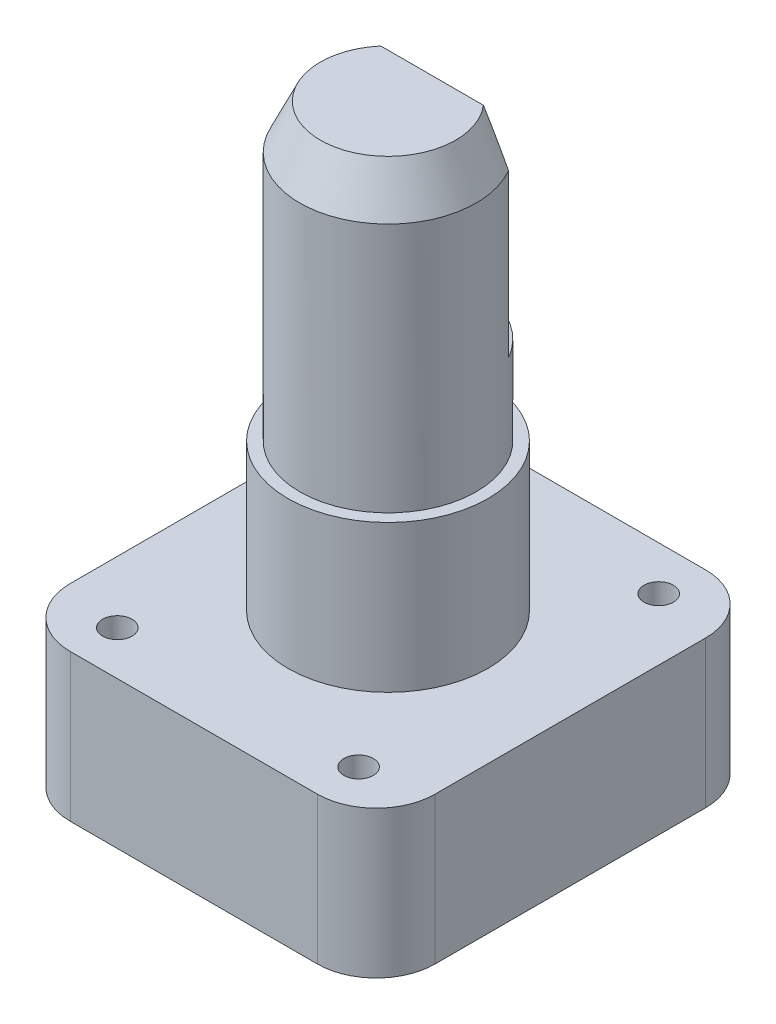
ISO-10303-21;
HEADER;
FILE_DESCRIPTION(('STEP AP214'),'2;1');
FILE_NAME('part.step','',(''),(''),'','','');
FILE_SCHEMA(('AUTOMOTIVE_DESIGN { 1 0 10303 214 1 1 1 1 }'));
ENDSEC;
DATA;
#1=APPLICATION_CONTEXT('core data for automotive mechanical design processes');
#2=APPLICATION_PROTOCOL_DEFINITION('international standard','automotive_design',2000,#1);
#3=PRODUCT_CONTEXT('',#1,'mechanical');
#4=PRODUCT('Part','Part','',(#3));
#5=PRODUCT_RELATED_PRODUCT_CATEGORY('part','',(#4));
#6=PRODUCT_DEFINITION_FORMATION('','',#4);
#7=PRODUCT_DEFINITION_CONTEXT('part definition',#1,'design');
#8=PRODUCT_DEFINITION('design','',#6,#7);
#9=PRODUCT_DEFINITION_SHAPE('','',#8);
#10=(LENGTH_UNIT() NAMED_UNIT(*) SI_UNIT(.MILLI.,.METRE.));
#11=(NAMED_UNIT(*) PLANE_ANGLE_UNIT() SI_UNIT($,.RADIAN.));
#12=(NAMED_UNIT(*) SI_UNIT($,.STERADIAN.) SOLID_ANGLE_UNIT());
#13=UNCERTAINTY_MEASURE_WITH_UNIT(LENGTH_MEASURE(1.E-05),#10,'distance_accuracy_value','');
#14=(GEOMETRIC_REPRESENTATION_CONTEXT(3) GLOBAL_UNCERTAINTY_ASSIGNED_CONTEXT((#13)) GLOBAL_UNIT_ASSIGNED_CONTEXT((#10,
#11,#12)) REPRESENTATION_CONTEXT('',''));
#15=CARTESIAN_POINT('',(0.,0.,0.));
#16=DIRECTION('',(0.,0.,1.));
#17=DIRECTION('',(1.,0.,0.));
#18=AXIS2_PLACEMENT_3D('',#15,#16,#17);
#19=CARTESIAN_POINT('',(0.,10.,0.));
#20=DIRECTION('',(0.,1.,0.));
#21=DIRECTION('',(0.,0.,1.));
#22=AXIS2_PLACEMENT_3D('',#19,#20,#21);
#23=PLANE('',#22);
#24=CARTESIAN_POINT('',(0.,10.,0.));
#25=DIRECTION('',(0.,1.,0.));
#26=DIRECTION('',(0.,0.,1.));
#27=AXIS2_PLACEMENT_3D('',#24,#25,#26);
#28=CIRCLE('',#27,3.4);
#29=CARTESIAN_POINT('',(0.,10.,3.4));
#30=VERTEX_POINT('',#29);
#31=EDGE_CURVE('E289',#30,#30,#28,.T.);
#32=ORIENTED_EDGE('',*,*,#31,.T.);
#33=EDGE_LOOP('',(#32));
#34=FACE_BOUND('',#33,.T.);
#35=CARTESIAN_POINT('',(0.,10.,0.));
#36=DIRECTION('',(0.,1.,0.));
#37=DIRECTION('',(0.,0.,1.));
#38=AXIS2_PLACEMENT_3D('',#35,#36,#37);
#39=CIRCLE('',#38,3.);
#40=CARTESIAN_POINT('',(0.,10.,3.));
#41=VERTEX_POINT('',#40);
#42=EDGE_CURVE('E293',#41,#41,#39,.T.);
#43=ORIENTED_EDGE('',*,*,#42,.F.);
#44=EDGE_LOOP('',(#43));
#45=FACE_BOUND('',#44,.T.);
#46=ADVANCED_FACE('F33',(#34,#45),#23,.T.);
#47=CARTESIAN_POINT('',(0.,5.,0.));
#48=DIRECTION('',(0.,1.,0.));
#49=DIRECTION('',(0.,0.,1.));
#50=AXIS2_PLACEMENT_3D('',#47,#48,#49);
#51=PLANE('',#50);
#52=CARTESIAN_POINT('',(4.1,5.,-5.1));
#53=DIRECTION('',(0.,1.,0.));
#54=DIRECTION('',(0.,0.,1.));
#55=AXIS2_PLACEMENT_3D('',#52,#53,#54);
#56=CIRCLE('',#55,0.500000000000001);
#57=CARTESIAN_POINT('',(4.1,5.,-4.6));
#58=VERTEX_POINT('',#57);
#59=EDGE_CURVE('E316',#58,#58,#56,.T.);
#60=ORIENTED_EDGE('',*,*,#59,.F.);
#61=EDGE_LOOP('',(#60));
#62=FACE_BOUND('',#61,.T.);
#63=CARTESIAN_POINT('',(-4.1,5.,-5.1));
#64=DIRECTION('',(0.,1.,0.));
#65=DIRECTION('',(0.,0.,1.));
#66=AXIS2_PLACEMENT_3D('',#63,#64,#65);
#67=CIRCLE('',#66,0.500000000000001);
#68=CARTESIAN_POINT('',(-4.1,5.,-4.6));
#69=VERTEX_POINT('',#68);
#70=EDGE_CURVE('E310',#69,#69,#67,.T.);
#71=ORIENTED_EDGE('',*,*,#70,.F.);
#72=EDGE_LOOP('',(#71));
#73=FACE_BOUND('',#72,.T.);
#74=CARTESIAN_POINT('',(-4.1,5.,5.1));
#75=DIRECTION('',(0.,1.,0.));
#76=DIRECTION('',(0.,0.,1.));
#77=AXIS2_PLACEMENT_3D('',#74,#75,#76);
#78=CIRCLE('',#77,0.500000000000001);
#79=CARTESIAN_POINT('',(-4.1,5.,5.6));
#80=VERTEX_POINT('',#79);
#81=EDGE_CURVE('E304',#80,#80,#78,.T.);
#82=ORIENTED_EDGE('',*,*,#81,.F.);
#83=EDGE_LOOP('',(#82));
#84=FACE_BOUND('',#83,.T.);
#85=CARTESIAN_POINT('',(4.1,5.,5.1));
#86=DIRECTION('',(0.,1.,0.));
#87=DIRECTION('',(0.,0.,1.));
#88=AXIS2_PLACEMENT_3D('',#85,#86,#87);
#89=CIRCLE('',#88,0.500000000000002);
#90=CARTESIAN_POINT('',(4.1,5.,5.6));
#91=VERTEX_POINT('',#90);
#92=EDGE_CURVE('E298',#91,#91,#89,.T.);
#93=ORIENTED_EDGE('',*,*,#92,.F.);
#94=EDGE_LOOP('',(#93));
#95=FACE_BOUND('',#94,.T.);
#96=DIRECTION('',(-1.,0.,0.));
#97=VECTOR('',#96,1.);
#98=CARTESIAN_POINT('',(-6.2,5.,-6.6));
#99=LINE('',#98,#97);
#100=CARTESIAN_POINT('',(4.2,5.,-6.6));
#101=VERTEX_POINT('',#100);
#102=CARTESIAN_POINT('',(-4.2,5.,-6.6));
#103=VERTEX_POINT('',#102);
#104=EDGE_CURVE('E260',#101,#103,#99,.T.);
#105=ORIENTED_EDGE('',*,*,#104,.T.);
#106=CARTESIAN_POINT('',(-4.2,5.,-4.6));
#107=DIRECTION('',(0.,1.,0.));
#108=DIRECTION('',(0.,0.,1.));
#109=AXIS2_PLACEMENT_3D('',#106,#107,#108);
#110=CIRCLE('',#109,2.);
#111=CARTESIAN_POINT('',(-6.2,5.,-4.6));
#112=VERTEX_POINT('',#111);
#113=EDGE_CURVE('E232',#103,#112,#110,.T.);
#114=ORIENTED_EDGE('',*,*,#113,.T.);
#115=DIRECTION('',(0.,0.,1.));
#116=VECTOR('',#115,1.);
#117=CARTESIAN_POINT('',(-6.2,5.,-6.6));
#118=LINE('',#117,#116);
#119=CARTESIAN_POINT('',(-6.2,5.,4.6));
#120=VERTEX_POINT('',#119);
#121=EDGE_CURVE('E251',#112,#120,#118,.T.);
#122=ORIENTED_EDGE('',*,*,#121,.T.);
#123=CARTESIAN_POINT('',(-4.2,5.,4.6));
#124=DIRECTION('',(0.,1.,0.));
#125=DIRECTION('',(0.,0.,1.));
#126=AXIS2_PLACEMENT_3D('',#123,#124,#125);
#127=CIRCLE('',#126,2.);
#128=CARTESIAN_POINT('',(-4.2,5.,6.6));
#129=VERTEX_POINT('',#128);
#130=EDGE_CURVE('E225',#120,#129,#127,.T.);
#131=ORIENTED_EDGE('',*,*,#130,.T.);
#132=DIRECTION('',(1.,0.,0.));
#133=VECTOR('',#132,1.);
#134=CARTESIAN_POINT('',(-6.2,5.,6.6));
#135=LINE('',#134,#133);
#136=CARTESIAN_POINT('',(4.2,5.,6.6));
#137=VERTEX_POINT('',#136);
#138=EDGE_CURVE('E281',#129,#137,#135,.T.);
#139=ORIENTED_EDGE('',*,*,#138,.T.);
#140=CARTESIAN_POINT('',(4.2,5.,4.6));
#141=DIRECTION('',(0.,1.,0.));
#142=DIRECTION('',(0.,0.,1.));
#143=AXIS2_PLACEMENT_3D('',#140,#141,#142);
#144=CIRCLE('',#143,2.);
#145=CARTESIAN_POINT('',(6.2,5.,4.6));
#146=VERTEX_POINT('',#145);
#147=EDGE_CURVE('E217',#137,#146,#144,.T.);
#148=ORIENTED_EDGE('',*,*,#147,.T.);
#149=DIRECTION('',(0.,0.,-1.));
#150=VECTOR('',#149,1.);
#151=CARTESIAN_POINT('',(6.2,5.,-6.6));
#152=LINE('',#151,#150);
#153=CARTESIAN_POINT('',(6.2,5.,-4.6));
#154=VERTEX_POINT('',#153);
#155=EDGE_CURVE('E239',#146,#154,#152,.T.);
#156=ORIENTED_EDGE('',*,*,#155,.T.);
#157=CARTESIAN_POINT('',(4.2,5.,-4.6));
#158=DIRECTION('',(0.,1.,0.));
#159=DIRECTION('',(0.,0.,1.));
#160=AXIS2_PLACEMENT_3D('',#157,#158,#159);
#161=CIRCLE('',#160,2.);
#162=EDGE_CURVE('E222',#154,#101,#161,.T.);
#163=ORIENTED_EDGE('',*,*,#162,.T.);
#164=EDGE_LOOP('',(#105,#114,#122,#131,#139,#148,#156,#163));
#165=FACE_BOUND('',#164,.T.);
#166=CARTESIAN_POINT('',(0.,5.,0.));
#167=DIRECTION('',(0.,1.,0.));
#168=DIRECTION('',(0.,0.,1.));
#169=AXIS2_PLACEMENT_3D('',#166,#167,#168);
#170=CIRCLE('',#169,3.4);
#171=CARTESIAN_POINT('',(0.,5.,3.4));
#172=VERTEX_POINT('',#171);
#173=EDGE_CURVE('E285',#172,#172,#170,.T.);
#174=ORIENTED_EDGE('',*,*,#173,.F.);
#175=EDGE_LOOP('',(#174));
#176=FACE_BOUND('',#175,.T.);
#177=ADVANCED_FACE('F171',(#62,#73,#84,#95,#165,#176),#51,.T.);
#178=CARTESIAN_POINT('',(-6.2,5.,-6.6));
#179=DIRECTION('',(1.,0.,0.));
#180=DIRECTION('',(0.,0.,-1.));
#181=AXIS2_PLACEMENT_3D('',#178,#179,#180);
#182=PLANE('',#181);
#183=ORIENTED_EDGE('',*,*,#121,.F.);
#184=DIRECTION('',(0.,-1.,0.));
#185=VECTOR('',#184,1.);
#186=CARTESIAN_POINT('',(-6.2,5.,-4.6));
#187=LINE('',#186,#185);
#188=CARTESIAN_POINT('',(-6.2,0.,-4.6));
#189=VERTEX_POINT('',#188);
#190=EDGE_CURVE('E259',#112,#189,#187,.T.);
#191=ORIENTED_EDGE('',*,*,#190,.T.);
#192=DIRECTION('',(0.,0.,1.));
#193=VECTOR('',#192,1.);
#194=CARTESIAN_POINT('',(-6.2,0.,-6.6));
#195=LINE('',#194,#193);
#196=CARTESIAN_POINT('',(-6.2,0.,4.6));
#197=VERTEX_POINT('',#196);
#198=EDGE_CURVE('E253',#189,#197,#195,.T.);
#199=ORIENTED_EDGE('',*,*,#198,.T.);
#200=DIRECTION('',(0.,-1.,0.));
#201=VECTOR('',#200,1.);
#202=CARTESIAN_POINT('',(-6.2,5.,4.6));
#203=LINE('',#202,#201);
#204=EDGE_CURVE('E257',#197,#120,#203,.F.);
#205=ORIENTED_EDGE('',*,*,#204,.T.);
#206=EDGE_LOOP('',(#183,#191,#199,#205));
#207=FACE_BOUND('',#206,.T.);
#208=ADVANCED_FACE('F179',(#207),#182,.F.);
#209=CARTESIAN_POINT('',(-6.2,5.,6.6));
#210=DIRECTION('',(0.,0.,-1.));
#211=DIRECTION('',(-1.,0.,0.));
#212=AXIS2_PLACEMENT_3D('',#209,#210,#211);
#213=PLANE('',#212);
#214=ORIENTED_EDGE('',*,*,#138,.F.);
#215=DIRECTION('',(0.,-1.,0.));
#216=VECTOR('',#215,1.);
#217=CARTESIAN_POINT('',(-4.2,5.,6.6));
#218=LINE('',#217,#216);
#219=CARTESIAN_POINT('',(-4.2,0.,6.6));
#220=VERTEX_POINT('',#219);
#221=EDGE_CURVE('E235',#129,#220,#218,.T.);
#222=ORIENTED_EDGE('',*,*,#221,.T.);
#223=DIRECTION('',(1.,0.,0.));
#224=VECTOR('',#223,1.);
#225=CARTESIAN_POINT('',(-6.2,0.,6.6));
#226=LINE('',#225,#224);
#227=CARTESIAN_POINT('',(4.2,0.,6.6));
#228=VERTEX_POINT('',#227);
#229=EDGE_CURVE('E248',#220,#228,#226,.T.);
#230=ORIENTED_EDGE('',*,*,#229,.T.);
#231=DIRECTION('',(0.,-1.,0.));
#232=VECTOR('',#231,1.);
#233=CARTESIAN_POINT('',(4.2,5.,6.6));
#234=LINE('',#233,#232);
#235=EDGE_CURVE('E218',#228,#137,#234,.F.);
#236=ORIENTED_EDGE('',*,*,#235,.T.);
#237=EDGE_LOOP('',(#214,#222,#230,#236));
#238=FACE_BOUND('',#237,.T.);
#239=ADVANCED_FACE('F193',(#238),#213,.F.);
#240=CARTESIAN_POINT('',(6.2,5.,-6.6));
#241=DIRECTION('',(-1.,0.,0.));
#242=DIRECTION('',(0.,0.,1.));
#243=AXIS2_PLACEMENT_3D('',#240,#241,#242);
#244=PLANE('',#243);
#245=DIRECTION('',(0.,0.,-1.));
#246=VECTOR('',#245,1.);
#247=CARTESIAN_POINT('',(6.2,0.,-6.6));
#248=LINE('',#247,#246);
#249=CARTESIAN_POINT('',(6.2,0.,4.6));
#250=VERTEX_POINT('',#249);
#251=CARTESIAN_POINT('',(6.2,0.,-4.6));
#252=VERTEX_POINT('',#251);
#253=EDGE_CURVE('E238',#250,#252,#248,.T.);
#254=ORIENTED_EDGE('',*,*,#253,.T.);
#255=DIRECTION('',(0.,-1.,0.));
#256=VECTOR('',#255,1.);
#257=CARTESIAN_POINT('',(6.2,5.,-4.6));
#258=LINE('',#257,#256);
#259=EDGE_CURVE('E57',#252,#154,#258,.F.);
#260=ORIENTED_EDGE('',*,*,#259,.T.);
#261=ORIENTED_EDGE('',*,*,#155,.F.);
#262=DIRECTION('',(0.,-1.,0.));
#263=VECTOR('',#262,1.);
#264=CARTESIAN_POINT('',(6.2,5.,4.6));
#265=LINE('',#264,#263);
#266=EDGE_CURVE('E134',#146,#250,#265,.T.);
#267=ORIENTED_EDGE('',*,*,#266,.T.);
#268=EDGE_LOOP('',(#254,#260,#261,#267));
#269=FACE_BOUND('',#268,.T.);
#270=ADVANCED_FACE('F189',(#269),#244,.F.);
#271=CARTESIAN_POINT('',(-6.2,5.,-6.6));
#272=DIRECTION('',(0.,0.,1.));
#273=DIRECTION('',(1.,0.,0.));
#274=AXIS2_PLACEMENT_3D('',#271,#272,#273);
#275=PLANE('',#274);
#276=DIRECTION('',(-1.,0.,0.));
#277=VECTOR('',#276,1.);
#278=CARTESIAN_POINT('',(-6.2,0.,-6.6));
#279=LINE('',#278,#277);
#280=CARTESIAN_POINT('',(4.2,0.,-6.6));
#281=VERTEX_POINT('',#280);
#282=CARTESIAN_POINT('',(-4.2,0.,-6.6));
#283=VERTEX_POINT('',#282);
#284=EDGE_CURVE('E247',#281,#283,#279,.T.);
#285=ORIENTED_EDGE('',*,*,#284,.T.);
#286=DIRECTION('',(0.,-1.,0.));
#287=VECTOR('',#286,1.);
#288=CARTESIAN_POINT('',(-4.2,5.,-6.6));
#289=LINE('',#288,#287);
#290=EDGE_CURVE('E223',#283,#103,#289,.F.);
#291=ORIENTED_EDGE('',*,*,#290,.T.);
#292=ORIENTED_EDGE('',*,*,#104,.F.);
#293=DIRECTION('',(0.,-1.,0.));
#294=VECTOR('',#293,1.);
#295=CARTESIAN_POINT('',(4.2,5.,-6.6));
#296=LINE('',#295,#294);
#297=EDGE_CURVE('E227',#101,#281,#296,.T.);
#298=ORIENTED_EDGE('',*,*,#297,.T.);
#299=EDGE_LOOP('',(#285,#291,#292,#298));
#300=FACE_BOUND('',#299,.T.);
#301=ADVANCED_FACE('F185',(#300),#275,.F.);
#302=CARTESIAN_POINT('',(0.,0.,0.));
#303=DIRECTION('',(0.,1.,0.));
#304=DIRECTION('',(0.,0.,1.));
#305=AXIS2_PLACEMENT_3D('',#302,#303,#304);
#306=PLANE('',#305);
#307=CARTESIAN_POINT('',(4.1,0.,-5.1));
#308=DIRECTION('',(0.,1.,0.));
#309=DIRECTION('',(0.,0.,1.));
#310=AXIS2_PLACEMENT_3D('',#307,#308,#309);
#311=CIRCLE('',#310,0.500000000000001);
#312=CARTESIAN_POINT('',(4.1,0.,-4.6));
#313=VERTEX_POINT('',#312);
#314=EDGE_CURVE('E313',#313,#313,#311,.T.);
#315=ORIENTED_EDGE('',*,*,#314,.T.);
#316=EDGE_LOOP('',(#315));
#317=FACE_BOUND('',#316,.T.);
#318=CARTESIAN_POINT('',(-4.1,0.,-5.1));
#319=DIRECTION('',(0.,1.,0.));
#320=DIRECTION('',(0.,0.,1.));
#321=AXIS2_PLACEMENT_3D('',#318,#319,#320);
#322=CIRCLE('',#321,0.500000000000001);
#323=CARTESIAN_POINT('',(-4.1,0.,-4.6));
#324=VERTEX_POINT('',#323);
#325=EDGE_CURVE('E307',#324,#324,#322,.T.);
#326=ORIENTED_EDGE('',*,*,#325,.T.);
#327=EDGE_LOOP('',(#326));
#328=FACE_BOUND('',#327,.T.);
#329=CARTESIAN_POINT('',(-4.1,0.,5.1));
#330=DIRECTION('',(0.,1.,0.));
#331=DIRECTION('',(0.,0.,1.));
#332=AXIS2_PLACEMENT_3D('',#329,#330,#331);
#333=CIRCLE('',#332,0.500000000000001);
#334=CARTESIAN_POINT('',(-4.1,0.,5.6));
#335=VERTEX_POINT('',#334);
#336=EDGE_CURVE('E301',#335,#335,#333,.T.);
#337=ORIENTED_EDGE('',*,*,#336,.T.);
#338=EDGE_LOOP('',(#337));
#339=FACE_BOUND('',#338,.T.);
#340=CARTESIAN_POINT('',(4.1,0.,5.1));
#341=DIRECTION('',(0.,1.,0.));
#342=DIRECTION('',(0.,0.,1.));
#343=AXIS2_PLACEMENT_3D('',#340,#341,#342);
#344=CIRCLE('',#343,0.500000000000002);
#345=CARTESIAN_POINT('',(4.1,0.,5.6));
#346=VERTEX_POINT('',#345);
#347=EDGE_CURVE('E297',#346,#346,#344,.T.);
#348=ORIENTED_EDGE('',*,*,#347,.T.);
#349=EDGE_LOOP('',(#348));
#350=FACE_BOUND('',#349,.T.);
#351=ORIENTED_EDGE('',*,*,#198,.F.);
#352=CARTESIAN_POINT('',(-4.2,0.,-4.6));
#353=DIRECTION('',(0.,1.,0.));
#354=DIRECTION('',(0.,0.,1.));
#355=AXIS2_PLACEMENT_3D('',#352,#353,#354);
#356=CIRCLE('',#355,2.);
#357=EDGE_CURVE('E267',#189,#283,#356,.F.);
#358=ORIENTED_EDGE('',*,*,#357,.T.);
#359=ORIENTED_EDGE('',*,*,#284,.F.);
#360=CARTESIAN_POINT('',(4.2,0.,-4.6));
#361=DIRECTION('',(0.,1.,0.));
#362=DIRECTION('',(0.,0.,1.));
#363=AXIS2_PLACEMENT_3D('',#360,#361,#362);
#364=CIRCLE('',#363,2.);
#365=EDGE_CURVE('E246',#281,#252,#364,.F.);
#366=ORIENTED_EDGE('',*,*,#365,.T.);
#367=ORIENTED_EDGE('',*,*,#253,.F.);
#368=CARTESIAN_POINT('',(4.2,0.,4.6));
#369=DIRECTION('',(0.,1.,0.));
#370=DIRECTION('',(0.,0.,1.));
#371=AXIS2_PLACEMENT_3D('',#368,#369,#370);
#372=CIRCLE('',#371,2.);
#373=EDGE_CURVE('E243',#250,#228,#372,.F.);
#374=ORIENTED_EDGE('',*,*,#373,.T.);
#375=ORIENTED_EDGE('',*,*,#229,.F.);
#376=CARTESIAN_POINT('',(-4.2,0.,4.6));
#377=DIRECTION('',(0.,1.,0.));
#378=DIRECTION('',(0.,0.,1.));
#379=AXIS2_PLACEMENT_3D('',#376,#377,#378);
#380=CIRCLE('',#379,2.);
#381=EDGE_CURVE('E265',#220,#197,#380,.F.);
#382=ORIENTED_EDGE('',*,*,#381,.T.);
#383=EDGE_LOOP('',(#351,#358,#359,#366,#367,#374,#375,#382));
#384=FACE_BOUND('',#383,.T.);
#385=ADVANCED_FACE('F181',(#317,#328,#339,#350,#384),#306,.F.);
#386=CARTESIAN_POINT('',(-4.2,5.,-4.6));
#387=DIRECTION('',(0.,-1.,0.));
#388=DIRECTION('',(0.,0.,-1.));
#389=AXIS2_PLACEMENT_3D('',#386,#387,#388);
#390=CYLINDRICAL_SURFACE('',#389,2.);
#391=ORIENTED_EDGE('',*,*,#113,.F.);
#392=ORIENTED_EDGE('',*,*,#290,.F.);
#393=ORIENTED_EDGE('',*,*,#357,.F.);
#394=ORIENTED_EDGE('',*,*,#190,.F.);
#395=EDGE_LOOP('',(#391,#392,#393,#394));
#396=FACE_BOUND('',#395,.T.);
#397=ADVANCED_FACE('F184',(#396),#390,.T.);
#398=CARTESIAN_POINT('',(-4.2,5.,4.6));
#399=DIRECTION('',(0.,-1.,0.));
#400=DIRECTION('',(0.,0.,-1.));
#401=AXIS2_PLACEMENT_3D('',#398,#399,#400);
#402=CYLINDRICAL_SURFACE('',#401,2.);
#403=ORIENTED_EDGE('',*,*,#130,.F.);
#404=ORIENTED_EDGE('',*,*,#204,.F.);
#405=ORIENTED_EDGE('',*,*,#381,.F.);
#406=ORIENTED_EDGE('',*,*,#221,.F.);
#407=EDGE_LOOP('',(#403,#404,#405,#406));
#408=FACE_BOUND('',#407,.T.);
#409=ADVANCED_FACE('F202',(#408),#402,.T.);
#410=CARTESIAN_POINT('',(4.2,5.,-4.6));
#411=DIRECTION('',(0.,-1.,0.));
#412=DIRECTION('',(0.,0.,-1.));
#413=AXIS2_PLACEMENT_3D('',#410,#411,#412);
#414=CYLINDRICAL_SURFACE('',#413,2.);
#415=ORIENTED_EDGE('',*,*,#162,.F.);
#416=ORIENTED_EDGE('',*,*,#259,.F.);
#417=ORIENTED_EDGE('',*,*,#365,.F.);
#418=ORIENTED_EDGE('',*,*,#297,.F.);
#419=EDGE_LOOP('',(#415,#416,#417,#418));
#420=FACE_BOUND('',#419,.T.);
#421=ADVANCED_FACE('F206',(#420),#414,.T.);
#422=CARTESIAN_POINT('',(4.2,5.,4.6));
#423=DIRECTION('',(0.,-1.,0.));
#424=DIRECTION('',(0.,0.,-1.));
#425=AXIS2_PLACEMENT_3D('',#422,#423,#424);
#426=CYLINDRICAL_SURFACE('',#425,2.);
#427=ORIENTED_EDGE('',*,*,#147,.F.);
#428=ORIENTED_EDGE('',*,*,#235,.F.);
#429=ORIENTED_EDGE('',*,*,#373,.F.);
#430=ORIENTED_EDGE('',*,*,#266,.F.);
#431=EDGE_LOOP('',(#427,#428,#429,#430));
#432=FACE_BOUND('',#431,.T.);
#433=ADVANCED_FACE('F175',(#432),#426,.T.);
#434=CARTESIAN_POINT('',(0.,10.,0.));
#435=DIRECTION('',(0.,-1.,0.));
#436=DIRECTION('',(0.,0.,-1.));
#437=AXIS2_PLACEMENT_3D('',#434,#435,#436);
#438=CYLINDRICAL_SURFACE('',#437,3.4);
#439=ORIENTED_EDGE('',*,*,#31,.F.);
#440=EDGE_LOOP('',(#439));
#441=FACE_BOUND('',#440,.T.);
#442=ORIENTED_EDGE('',*,*,#173,.T.);
#443=EDGE_LOOP('',(#442));
#444=FACE_BOUND('',#443,.T.);
#445=ADVANCED_FACE('F167',(#441,#444),#438,.T.);
#446=CARTESIAN_POINT('',(0.,20.,0.));
#447=DIRECTION('',(0.,-1.,0.));
#448=DIRECTION('',(0.,0.,-1.));
#449=AXIS2_PLACEMENT_3D('',#446,#447,#448);
#450=CYLINDRICAL_SURFACE('',#449,3.);
#451=CARTESIAN_POINT('',(0.,18.5,0.));
#452=DIRECTION('',(0.,1.,0.));
#453=DIRECTION('',(0.,0.,1.));
#454=AXIS2_PLACEMENT_3D('',#451,#452,#453);
#455=CIRCLE('',#454,3.);
#456=CARTESIAN_POINT('',(2.59807621135332,18.5,-1.5));
#457=VERTEX_POINT('',#456);
#458=CARTESIAN_POINT('',(-2.59807621135332,18.5,-1.5));
#459=VERTEX_POINT('',#458);
#460=EDGE_CURVE('E131',#457,#459,#455,.F.);
#461=ORIENTED_EDGE('',*,*,#460,.T.);
#462=DIRECTION('',(0.,-1.,0.));
#463=VECTOR('',#462,1.);
#464=CARTESIAN_POINT('',(-2.59807621135332,20.,-1.5));
#465=LINE('',#464,#463);
#466=CARTESIAN_POINT('',(-2.59807621135332,13.,-1.5));
#467=VERTEX_POINT('',#466);
#468=EDGE_CURVE('E119',#459,#467,#465,.T.);
#469=ORIENTED_EDGE('',*,*,#468,.T.);
#470=CARTESIAN_POINT('',(0.,13.,0.));
#471=DIRECTION('',(0.,-1.,0.));
#472=DIRECTION('',(0.,0.,-1.));
#473=AXIS2_PLACEMENT_3D('',#470,#471,#472);
#474=CIRCLE('',#473,3.);
#475=CARTESIAN_POINT('',(2.59807621135332,13.,-1.5));
#476=VERTEX_POINT('',#475);
#477=EDGE_CURVE('E11',#467,#476,#474,.T.);
#478=ORIENTED_EDGE('',*,*,#477,.T.);
#479=DIRECTION('',(0.,-1.,0.));
#480=VECTOR('',#479,1.);
#481=CARTESIAN_POINT('',(2.59807621135332,20.,-1.5));
#482=LINE('',#481,#480);
#483=EDGE_CURVE('E322',#476,#457,#482,.F.);
#484=ORIENTED_EDGE('',*,*,#483,.T.);
#485=EDGE_LOOP('',(#461,#469,#478,#484));
#486=FACE_BOUND('',#485,.T.);
#487=ORIENTED_EDGE('',*,*,#42,.T.);
#488=EDGE_LOOP('',(#487));
#489=FACE_BOUND('',#488,.T.);
#490=ADVANCED_FACE('F164',(#486,#489),#450,.T.);
#491=CARTESIAN_POINT('',(0.,20.,0.));
#492=DIRECTION('',(0.,1.,0.));
#493=DIRECTION('',(0.,0.,1.));
#494=AXIS2_PLACEMENT_3D('',#491,#492,#493);
#495=PLANE('',#494);
#496=DIRECTION('',(1.,0.,0.));
#497=VECTOR('',#496,1.);
#498=CARTESIAN_POINT('',(-3.,20.,-1.5));
#499=LINE('',#498,#497);
#500=CARTESIAN_POINT('',(-1.74426988987556,20.,-1.5));
#501=VERTEX_POINT('',#500);
#502=CARTESIAN_POINT('',(1.74426988987556,20.,-1.5));
#503=VERTEX_POINT('',#502);
#504=EDGE_CURVE('E49',#501,#503,#499,.T.);
#505=ORIENTED_EDGE('',*,*,#504,.F.);
#506=CARTESIAN_POINT('',(0.,20.,0.));
#507=DIRECTION('',(0.,1.,0.));
#508=DIRECTION('',(0.,0.,1.));
#509=AXIS2_PLACEMENT_3D('',#506,#507,#508);
#510=CIRCLE('',#509,2.3005385127675);
#511=EDGE_CURVE('E128',#501,#503,#510,.T.);
#512=ORIENTED_EDGE('',*,*,#511,.T.);
#513=EDGE_LOOP('',(#505,#512));
#514=FACE_BOUND('',#513,.T.);
#515=ADVANCED_FACE('F127',(#514),#495,.T.);
#516=CARTESIAN_POINT('',(0.,20.,0.));
#517=DIRECTION('',(0.,-1.,0.));
#518=DIRECTION('',(0.,0.,-1.));
#519=AXIS2_PLACEMENT_3D('',#516,#517,#518);
#520=CONICAL_SURFACE('',#519,2.3005385127675,0.43633231299858);
#521=CARTESIAN_POINT('',(-4.48634629337353,14.7890049369441,-1.5));
#522=CARTESIAN_POINT('',(-4.36536353401556,15.0350222116845,-1.5));
#523=CARTESIAN_POINT('',(-4.24401557611287,15.2808614870655,-1.5));
#524=CARTESIAN_POINT('',(-4.00027715066354,15.7720745036663,-1.5));
#525=CARTESIAN_POINT('',(-3.87788650945851,16.017448158674,-1.5));
#526=CARTESIAN_POINT('',(-3.63106084659654,16.5089917999705,-1.5));
#527=CARTESIAN_POINT('',(-3.50661800077086,16.7551578626342,-1.5));
#528=CARTESIAN_POINT('',(-3.25595186761916,17.2465392403005,-1.5));
#529=CARTESIAN_POINT('',(-3.1297288400158,17.4917546874736,-1.5));
#530=CARTESIAN_POINT('',(-2.87264209228844,17.9849493562221,-1.5));
#531=CARTESIAN_POINT('',(-2.74173609303867,18.2329065725816,-1.5));
#532=CARTESIAN_POINT('',(-2.47605015649954,18.7268943037996,-1.5));
#533=CARTESIAN_POINT('',(-2.3412685559151,18.9729239319691,-1.5));
#534=CARTESIAN_POINT('',(-2.13471875946045,19.339046784239,-1.5));
#535=CARTESIAN_POINT('',(-2.06524116423049,19.4604302432215,-1.5));
#536=CARTESIAN_POINT('',(-1.9242893123602,19.7020297737031,-1.5));
#537=CARTESIAN_POINT('',(-1.85281515448809,19.8222459025539,-1.5));
#538=CARTESIAN_POINT('',(-1.70724235574868,20.0609678253578,-1.5));
#539=CARTESIAN_POINT('',(-1.63314558473884,20.1794747563359,-1.5));
#540=CARTESIAN_POINT('',(-1.48125917461211,20.4140887490386,-1.5));
#541=CARTESIAN_POINT('',(-1.40347051803704,20.53019643761,-1.5));
#542=CARTESIAN_POINT('',(-1.29193417253642,20.6883922791273,-1.5));
#543=CARTESIAN_POINT('',(-1.26050333420291,20.7321136836658,-1.5));
#544=CARTESIAN_POINT('',(-1.19667232177286,20.8188540055869,-1.5));
#545=CARTESIAN_POINT('',(-1.16427202581672,20.861872833597,-1.5));
#546=CARTESIAN_POINT('',(-1.09819035603642,20.9472039770577,-1.5));
#547=CARTESIAN_POINT('',(-1.06450422749178,20.9895126235169,-1.5));
#548=CARTESIAN_POINT('',(-0.995746507819696,21.0729869751614,-1.5));
#549=CARTESIAN_POINT('',(-0.960675061599744,21.1141527991256,-1.5));
#550=CARTESIAN_POINT('',(-0.888465248620626,21.1954200336215,-1.5));
#551=CARTESIAN_POINT('',(-0.85130899535882,21.2355056559828,-1.5));
#552=CARTESIAN_POINT('',(-0.774887126950667,21.3136078624051,-1.5));
#553=CARTESIAN_POINT('',(-0.735622215362724,21.3516251281596,-1.5));
#554=CARTESIAN_POINT('',(-0.654658227836865,21.424624547253,-1.5));
#555=CARTESIAN_POINT('',(-0.612971013918076,21.4596196979482,-1.5));
#556=CARTESIAN_POINT('',(-0.526484188378192,21.5254728596231,-1.5));
#557=CARTESIAN_POINT('',(-0.481689745503311,21.5563375023089,-1.5));
#558=CARTESIAN_POINT('',(-0.394911937030248,21.6081710209221,-1.5));
#559=CARTESIAN_POINT('',(-0.35340348953882,21.6299190978135,-1.5));
#560=CARTESIAN_POINT('',(-0.267662426041691,21.6671837611396,-1.5));
#561=CARTESIAN_POINT('',(-0.2234338570301,21.6827093584962,-1.5));
#562=CARTESIAN_POINT('',(-0.132212100068523,21.7057614975542,-1.5));
#563=CARTESIAN_POINT('',(-0.0851897235093035,21.7131776137096,-1.5));
#564=CARTESIAN_POINT('',(0.00939450263206873,21.7182901430756,-1.5));
#565=CARTESIAN_POINT('',(0.0569561330650801,21.7159903728553,-1.5));
#566=CARTESIAN_POINT('',(0.143719877192678,21.7031681344389,-1.5));
#567=CARTESIAN_POINT('',(0.183121029771079,21.6939073341445,-1.5));
#568=CARTESIAN_POINT('',(0.260117788214515,21.6697739647636,-1.5));
#569=CARTESIAN_POINT('',(0.297713104285615,21.6549004983463,-1.5));
#570=CARTESIAN_POINT('',(0.399953862061299,21.6072282338519,-1.5));
#571=CARTESIAN_POINT('',(0.462320188404124,21.5695831886761,-1.5));
#572=CARTESIAN_POINT('',(0.551360933903635,21.5068621161758,-1.5));
#573=CARTESIAN_POINT('',(0.580368573916408,21.4848385312394,-1.5));
#574=CARTESIAN_POINT('',(0.637044413756698,21.4391339354702,-1.5));
#575=CARTESIAN_POINT('',(0.664713201876009,21.4154536639812,-1.5));
#576=CARTESIAN_POINT('',(0.748051945805434,21.3406186581593,-1.5));
#577=CARTESIAN_POINT('',(0.801796016311455,21.2873334020797,-1.5));
#578=CARTESIAN_POINT('',(0.905575777813346,21.1772384885967,-1.5));
#579=CARTESIAN_POINT('',(0.955607462194863,21.1204251415051,-1.5));
#580=CARTESIAN_POINT('',(1.05298765826435,21.0042471349936,-1.5));
#581=CARTESIAN_POINT('',(1.10032698374155,20.9448748293157,-1.5));
#582=CARTESIAN_POINT('',(1.19280318047162,20.8244319064503,-1.5));
#583=CARTESIAN_POINT('',(1.23793955287492,20.7633609094713,-1.5));
#584=CARTESIAN_POINT('',(1.37200595511129,20.576581557788,-1.5));
#585=CARTESIAN_POINT('',(1.4582611363079,20.4489590490266,-1.5));
#586=CARTESIAN_POINT('',(1.62599466113343,20.1910604941043,-1.5));
#587=CARTESIAN_POINT('',(1.70748300786002,20.0607908388114,-1.5));
#588=CARTESIAN_POINT('',(1.8528853914169,19.8219333671462,-1.5));
#589=CARTESIAN_POINT('',(1.91732283166579,19.7136630204569,-1.5));
#590=CARTESIAN_POINT('',(2.04454267852032,19.4961546829622,-1.5));
#591=CARTESIAN_POINT('',(2.10732505172617,19.3869166726883,-1.5));
#592=CARTESIAN_POINT('',(2.29376163301828,19.0580784706418,-1.5));
#593=CARTESIAN_POINT('',(2.41548637566429,18.8373857387284,-1.5));
#594=CARTESIAN_POINT('',(2.6557750185109,18.3938519038446,-1.5));
#595=CARTESIAN_POINT('',(2.77433365592014,18.171007971823,-1.5));
#596=CARTESIAN_POINT('',(3.00909450630298,17.7241074578894,-1.5));
#597=CARTESIAN_POINT('',(3.1252969105526,17.5000509762966,-1.5));
#598=CARTESIAN_POINT('',(3.34669381602089,17.0691767432927,-1.5));
#599=CARTESIAN_POINT('',(3.45202007885831,16.8624265257514,-1.5));
#600=CARTESIAN_POINT('',(3.66156920262716,16.4483615004387,-1.5));
#601=CARTESIAN_POINT('',(3.76579203545143,16.2410466784537,-1.5));
#602=CARTESIAN_POINT('',(3.97313081217531,15.8264676675694,-1.5));
#603=CARTESIAN_POINT('',(4.07624876749503,15.6192044835139,-1.5));
#604=CARTESIAN_POINT('',(4.28178248724231,15.2043395004231,-1.5));
#605=CARTESIAN_POINT('',(4.38419827703245,14.9967377139571,-1.5));
#606=CARTESIAN_POINT('',(4.48634629337353,14.7890049369441,-1.5));
#607=B_SPLINE_CURVE_WITH_KNOTS('',3,(#521,#522,#523,#524,#525,#526,#527,#528,#529,#530,#531,
#532,#533,#534,#535,#536,#537,#538,#539,#540,#541,#542,#543,#544,#545,#546,#547,#548,#549,#550,
#551,#552,#553,#554,#555,#556,#557,#558,#559,#560,#561,#562,#563,#564,#565,#566,#567,#568,#569,
#570,#571,#572,#573,#574,#575,#576,#577,#578,#579,#580,#581,#582,#583,#584,#585,#586,#587,#588,
#589,#590,#591,#592,#593,#594,#595,#596,#597,#598,#599,#600,#601,#602,#603,#604,#605,#606),
.UNSPECIFIED.,.F.,.F.,(4,2,2,2,2,2,2,2,2,2,2,2,2,2,2,2,2,2,2,2,2,2,2,2,2,2,2,2,2,2,2,2,2,2,2,2,
2,2,2,2,2,2,4),(0.,0.822468864068455,1.64507749748504,2.4725709376199,3.29994487307705,
4.14110114072297,4.98262396072489,5.40219367129245,5.82174266274075,6.24099832453482,
6.66014302643429,6.8216726648213,6.98322269328998,7.14544255773249,7.30764549829958,
7.4715577283969,7.63541560455685,7.79852947199519,7.96137822819081,8.10158789275827,
8.24159377628748,8.38348323179061,8.52531695583111,8.6462495573378,8.76720150126232,
8.9843943855062,9.09363734335152,9.20283185563304,9.42959191508813,9.65659325051533,
9.88432761808676,10.1121133181427,10.574041020252,11.0349617713112,11.4129265886542,
11.7908990276197,12.5469544570395,13.3041969424373,14.0613777077402,14.7574726441929,
15.4535852694981,16.1480779860634,16.8425454836076),.UNSPECIFIED.);
#608=EDGE_CURVE('E42',#459,#501,#607,.T.);
#609=ORIENTED_EDGE('',*,*,#608,.F.);
#610=ORIENTED_EDGE('',*,*,#460,.F.);
#611=EDGE_CURVE('E124',#503,#457,#607,.T.);
#612=ORIENTED_EDGE('',*,*,#611,.F.);
#613=ORIENTED_EDGE('',*,*,#511,.F.);
#614=EDGE_LOOP('',(#609,#610,#612,#613));
#615=FACE_BOUND('',#614,.T.);
#616=ADVANCED_FACE('F35',(#615),#520,.T.);
#617=CARTESIAN_POINT('',(4.1,0.,5.1));
#618=DIRECTION('',(0.,1.,0.));
#619=DIRECTION('',(0.,0.,1.));
#620=AXIS2_PLACEMENT_3D('',#617,#618,#619);
#621=CYLINDRICAL_SURFACE('',#620,0.500000000000002);
#622=ORIENTED_EDGE('',*,*,#347,.F.);
#623=EDGE_LOOP('',(#622));
#624=FACE_BOUND('',#623,.T.);
#625=ORIENTED_EDGE('',*,*,#92,.T.);
#626=EDGE_LOOP('',(#625));
#627=FACE_BOUND('',#626,.T.);
#628=ADVANCED_FACE('F157',(#624,#627),#621,.F.);
#629=CARTESIAN_POINT('',(-4.1,0.,5.1));
#630=DIRECTION('',(0.,1.,0.));
#631=DIRECTION('',(0.,0.,1.));
#632=AXIS2_PLACEMENT_3D('',#629,#630,#631);
#633=CYLINDRICAL_SURFACE('',#632,0.500000000000001);
#634=ORIENTED_EDGE('',*,*,#336,.F.);
#635=EDGE_LOOP('',(#634));
#636=FACE_BOUND('',#635,.T.);
#637=ORIENTED_EDGE('',*,*,#81,.T.);
#638=EDGE_LOOP('',(#637));
#639=FACE_BOUND('',#638,.T.);
#640=ADVANCED_FACE('F153',(#636,#639),#633,.F.);
#641=CARTESIAN_POINT('',(-4.1,0.,-5.1));
#642=DIRECTION('',(0.,1.,0.));
#643=DIRECTION('',(0.,0.,1.));
#644=AXIS2_PLACEMENT_3D('',#641,#642,#643);
#645=CYLINDRICAL_SURFACE('',#644,0.500000000000001);
#646=ORIENTED_EDGE('',*,*,#325,.F.);
#647=EDGE_LOOP('',(#646));
#648=FACE_BOUND('',#647,.T.);
#649=ORIENTED_EDGE('',*,*,#70,.T.);
#650=EDGE_LOOP('',(#649));
#651=FACE_BOUND('',#650,.T.);
#652=ADVANCED_FACE('F149',(#648,#651),#645,.F.);
#653=CARTESIAN_POINT('',(4.1,0.,-5.1));
#654=DIRECTION('',(0.,1.,0.));
#655=DIRECTION('',(0.,0.,1.));
#656=AXIS2_PLACEMENT_3D('',#653,#654,#655);
#657=CYLINDRICAL_SURFACE('',#656,0.500000000000001);
#658=ORIENTED_EDGE('',*,*,#314,.F.);
#659=EDGE_LOOP('',(#658));
#660=FACE_BOUND('',#659,.T.);
#661=ORIENTED_EDGE('',*,*,#59,.T.);
#662=EDGE_LOOP('',(#661));
#663=FACE_BOUND('',#662,.T.);
#664=ADVANCED_FACE('F146',(#660,#663),#657,.F.);
#665=CARTESIAN_POINT('',(0.,13.,0.));
#666=DIRECTION('',(0.,-1.,0.));
#667=DIRECTION('',(0.,0.,-1.));
#668=AXIS2_PLACEMENT_3D('',#665,#666,#667);
#669=PLANE('',#668);
#670=ORIENTED_EDGE('',*,*,#477,.F.);
#671=DIRECTION('',(1.,0.,0.));
#672=VECTOR('',#671,1.);
#673=CARTESIAN_POINT('',(-3.,13.,-1.5));
#674=LINE('',#673,#672);
#675=EDGE_CURVE('E129',#467,#476,#674,.T.);
#676=ORIENTED_EDGE('',*,*,#675,.T.);
#677=EDGE_LOOP('',(#670,#676));
#678=FACE_BOUND('',#677,.T.);
#679=ADVANCED_FACE('F145',(#678),#669,.F.);
#680=CARTESIAN_POINT('',(-3.,13.,-1.5));
#681=DIRECTION('',(0.,0.,1.));
#682=DIRECTION('',(1.,0.,0.));
#683=AXIS2_PLACEMENT_3D('',#680,#681,#682);
#684=PLANE('',#683);
#685=ORIENTED_EDGE('',*,*,#608,.T.);
#686=ORIENTED_EDGE('',*,*,#504,.T.);
#687=ORIENTED_EDGE('',*,*,#611,.T.);
#688=ORIENTED_EDGE('',*,*,#483,.F.);
#689=ORIENTED_EDGE('',*,*,#675,.F.);
#690=ORIENTED_EDGE('',*,*,#468,.F.);
#691=EDGE_LOOP('',(#685,#686,#687,#688,#689,#690));
#692=FACE_BOUND('',#691,.T.);
#693=ADVANCED_FACE('F116',(#692),#684,.F.);
#694=CLOSED_SHELL('',(#46,#177,#208,#239,#270,#301,#385,#397,#409,#421,#433,#445,#490,#515,#616,
#628,#640,#652,#664,#679,#693));
#695=MANIFOLD_SOLID_BREP('B2',#694);
#696=ADVANCED_BREP_SHAPE_REPRESENTATION('',(#18,#695),#14);
#697=SHAPE_DEFINITION_REPRESENTATION(#9,#696);
ENDSEC;
END-ISO-10303-21;
